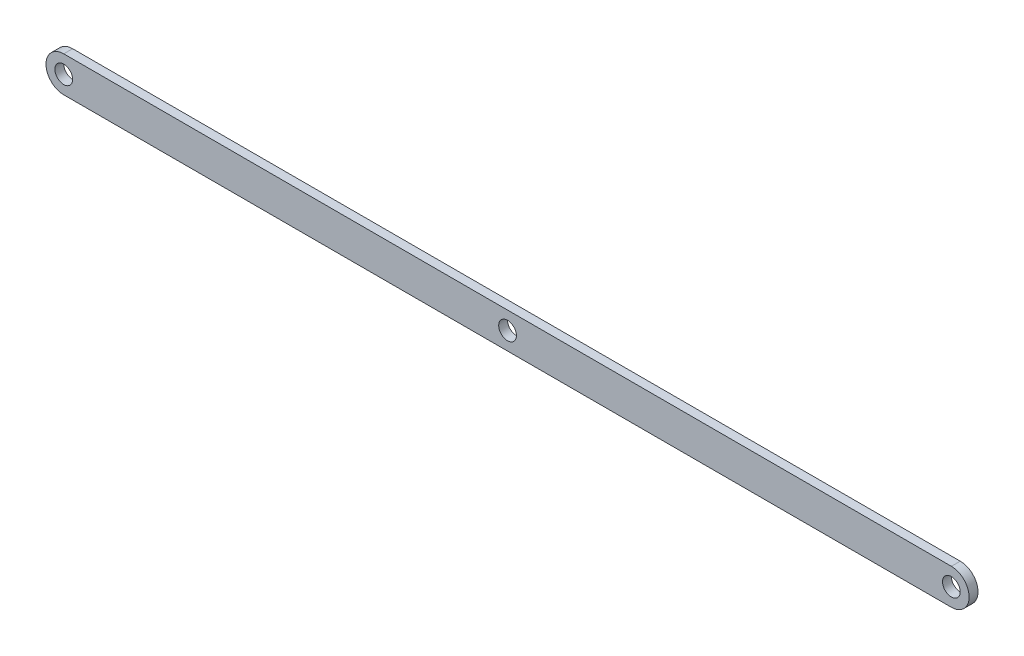
ISO-10303-21;
HEADER;
FILE_DESCRIPTION(('STEP AP214'),'2;1');
FILE_NAME('part.step','',(''),(''),'','','');
FILE_SCHEMA(('AUTOMOTIVE_DESIGN { 1 0 10303 214 1 1 1 1 }'));
ENDSEC;
DATA;
#1=APPLICATION_CONTEXT('core data for automotive mechanical design processes');
#2=APPLICATION_PROTOCOL_DEFINITION('international standard','automotive_design',2000,#1);
#3=PRODUCT_CONTEXT('',#1,'mechanical');
#4=PRODUCT('Part','Part','',(#3));
#5=PRODUCT_RELATED_PRODUCT_CATEGORY('part','',(#4));
#6=PRODUCT_DEFINITION_FORMATION('','',#4);
#7=PRODUCT_DEFINITION_CONTEXT('part definition',#1,'design');
#8=PRODUCT_DEFINITION('design','',#6,#7);
#9=PRODUCT_DEFINITION_SHAPE('','',#8);
#10=(LENGTH_UNIT() NAMED_UNIT(*) SI_UNIT(.MILLI.,.METRE.));
#11=(NAMED_UNIT(*) PLANE_ANGLE_UNIT() SI_UNIT($,.RADIAN.));
#12=(NAMED_UNIT(*) SI_UNIT($,.STERADIAN.) SOLID_ANGLE_UNIT());
#13=UNCERTAINTY_MEASURE_WITH_UNIT(LENGTH_MEASURE(1.E-05),#10,'distance_accuracy_value','');
#14=(GEOMETRIC_REPRESENTATION_CONTEXT(3) GLOBAL_UNCERTAINTY_ASSIGNED_CONTEXT((#13)) GLOBAL_UNIT_ASSIGNED_CONTEXT((#10,
#11,#12)) REPRESENTATION_CONTEXT('',''));
#15=CARTESIAN_POINT('',(0.,0.,0.));
#16=DIRECTION('',(0.,0.,1.));
#17=DIRECTION('',(1.,0.,0.));
#18=AXIS2_PLACEMENT_3D('',#15,#16,#17);
#19=CARTESIAN_POINT('',(-250.,0.,5.));
#20=DIRECTION('',(0.,0.,1.));
#21=DIRECTION('',(1.,0.,0.));
#22=AXIS2_PLACEMENT_3D('',#19,#20,#21);
#23=PLANE('',#22);
#24=CARTESIAN_POINT('',(0.,0.,5.));
#25=DIRECTION('',(0.,0.,1.));
#26=DIRECTION('',(1.,0.,0.));
#27=AXIS2_PLACEMENT_3D('',#24,#25,#26);
#28=CIRCLE('',#27,4.99999999999999);
#29=CARTESIAN_POINT('',(4.99999999999999,0.,5.));
#30=VERTEX_POINT('',#29);
#31=EDGE_CURVE('E117',#30,#30,#28,.T.);
#32=ORIENTED_EDGE('',*,*,#31,.F.);
#33=EDGE_LOOP('',(#32));
#34=FACE_BOUND('',#33,.T.);
#35=CARTESIAN_POINT('',(-250.,0.,5.));
#36=DIRECTION('',(0.,0.,1.));
#37=DIRECTION('',(1.,0.,0.));
#38=AXIS2_PLACEMENT_3D('',#35,#36,#37);
#39=CIRCLE('',#38,10.);
#40=CARTESIAN_POINT('',(-250.,10.,5.));
#41=VERTEX_POINT('',#40);
#42=CARTESIAN_POINT('',(-250.,-10.,5.));
#43=VERTEX_POINT('',#42);
#44=EDGE_CURVE('E87',#41,#43,#39,.T.);
#45=ORIENTED_EDGE('',*,*,#44,.T.);
#46=DIRECTION('',(1.,0.,0.));
#47=VECTOR('',#46,1.);
#48=CARTESIAN_POINT('',(-250.,-10.,5.));
#49=LINE('',#48,#47);
#50=CARTESIAN_POINT('',(250.,-10.,5.));
#51=VERTEX_POINT('',#50);
#52=EDGE_CURVE('E82',#43,#51,#49,.T.);
#53=ORIENTED_EDGE('',*,*,#52,.T.);
#54=CARTESIAN_POINT('',(250.,0.,5.));
#55=DIRECTION('',(0.,0.,1.));
#56=DIRECTION('',(1.,0.,0.));
#57=AXIS2_PLACEMENT_3D('',#54,#55,#56);
#58=CIRCLE('',#57,10.);
#59=CARTESIAN_POINT('',(250.,10.0000000000001,5.));
#60=VERTEX_POINT('',#59);
#61=EDGE_CURVE('E85',#51,#60,#58,.T.);
#62=ORIENTED_EDGE('',*,*,#61,.T.);
#63=DIRECTION('',(-1.,0.,0.));
#64=VECTOR('',#63,1.);
#65=CARTESIAN_POINT('',(-250.,10.,5.));
#66=LINE('',#65,#64);
#67=EDGE_CURVE('E52',#60,#41,#66,.T.);
#68=ORIENTED_EDGE('',*,*,#67,.T.);
#69=EDGE_LOOP('',(#45,#53,#62,#68));
#70=FACE_BOUND('',#69,.T.);
#71=CARTESIAN_POINT('',(-250.,0.,5.));
#72=DIRECTION('',(0.,0.,1.));
#73=DIRECTION('',(1.,0.,0.));
#74=AXIS2_PLACEMENT_3D('',#71,#72,#73);
#75=CIRCLE('',#74,4.99999999999999);
#76=CARTESIAN_POINT('',(-245.,0.,5.));
#77=VERTEX_POINT('',#76);
#78=EDGE_CURVE('E102',#77,#77,#75,.T.);
#79=ORIENTED_EDGE('',*,*,#78,.F.);
#80=EDGE_LOOP('',(#79));
#81=FACE_BOUND('',#80,.T.);
#82=CARTESIAN_POINT('',(250.,0.,5.));
#83=DIRECTION('',(0.,0.,1.));
#84=DIRECTION('',(1.,0.,0.));
#85=AXIS2_PLACEMENT_3D('',#82,#83,#84);
#86=CIRCLE('',#85,4.99999999999999);
#87=CARTESIAN_POINT('',(255.,0.,5.));
#88=VERTEX_POINT('',#87);
#89=EDGE_CURVE('E123',#88,#88,#86,.T.);
#90=ORIENTED_EDGE('',*,*,#89,.F.);
#91=EDGE_LOOP('',(#90));
#92=FACE_BOUND('',#91,.T.);
#93=ADVANCED_FACE('F35',(#34,#70,#81,#92),#23,.T.);
#94=CARTESIAN_POINT('',(-250.,0.,0.));
#95=DIRECTION('',(0.,0.,1.));
#96=DIRECTION('',(1.,0.,0.));
#97=AXIS2_PLACEMENT_3D('',#94,#95,#96);
#98=PLANE('',#97);
#99=CARTESIAN_POINT('',(-250.,0.,0.));
#100=DIRECTION('',(0.,0.,1.));
#101=DIRECTION('',(1.,0.,0.));
#102=AXIS2_PLACEMENT_3D('',#99,#100,#101);
#103=CIRCLE('',#102,10.);
#104=CARTESIAN_POINT('',(-250.,10.,0.));
#105=VERTEX_POINT('',#104);
#106=CARTESIAN_POINT('',(-250.,-10.,0.));
#107=VERTEX_POINT('',#106);
#108=EDGE_CURVE('E99',#105,#107,#103,.T.);
#109=ORIENTED_EDGE('',*,*,#108,.F.);
#110=DIRECTION('',(-1.,0.,0.));
#111=VECTOR('',#110,1.);
#112=CARTESIAN_POINT('',(-250.,10.,0.));
#113=LINE('',#112,#111);
#114=CARTESIAN_POINT('',(250.,10.0000000000001,0.));
#115=VERTEX_POINT('',#114);
#116=EDGE_CURVE('E75',#115,#105,#113,.T.);
#117=ORIENTED_EDGE('',*,*,#116,.F.);
#118=CARTESIAN_POINT('',(250.,0.,0.));
#119=DIRECTION('',(0.,0.,1.));
#120=DIRECTION('',(1.,0.,0.));
#121=AXIS2_PLACEMENT_3D('',#118,#119,#120);
#122=CIRCLE('',#121,10.);
#123=CARTESIAN_POINT('',(250.,-10.,0.));
#124=VERTEX_POINT('',#123);
#125=EDGE_CURVE('E69',#124,#115,#122,.T.);
#126=ORIENTED_EDGE('',*,*,#125,.F.);
#127=DIRECTION('',(1.,0.,0.));
#128=VECTOR('',#127,1.);
#129=CARTESIAN_POINT('',(-250.,-10.,0.));
#130=LINE('',#129,#128);
#131=EDGE_CURVE('E91',#107,#124,#130,.T.);
#132=ORIENTED_EDGE('',*,*,#131,.F.);
#133=EDGE_LOOP('',(#109,#117,#126,#132));
#134=FACE_BOUND('',#133,.T.);
#135=CARTESIAN_POINT('',(-250.,0.,0.));
#136=DIRECTION('',(0.,0.,1.));
#137=DIRECTION('',(1.,0.,0.));
#138=AXIS2_PLACEMENT_3D('',#135,#136,#137);
#139=CIRCLE('',#138,4.99999999999999);
#140=CARTESIAN_POINT('',(-245.,0.,0.));
#141=VERTEX_POINT('',#140);
#142=EDGE_CURVE('E114',#141,#141,#139,.T.);
#143=ORIENTED_EDGE('',*,*,#142,.T.);
#144=EDGE_LOOP('',(#143));
#145=FACE_BOUND('',#144,.T.);
#146=CARTESIAN_POINT('',(0.,0.,0.));
#147=DIRECTION('',(0.,0.,1.));
#148=DIRECTION('',(1.,0.,0.));
#149=AXIS2_PLACEMENT_3D('',#146,#147,#148);
#150=CIRCLE('',#149,4.99999999999999);
#151=CARTESIAN_POINT('',(4.99999999999999,0.,0.));
#152=VERTEX_POINT('',#151);
#153=EDGE_CURVE('E120',#152,#152,#150,.T.);
#154=ORIENTED_EDGE('',*,*,#153,.T.);
#155=EDGE_LOOP('',(#154));
#156=FACE_BOUND('',#155,.T.);
#157=CARTESIAN_POINT('',(250.,0.,0.));
#158=DIRECTION('',(0.,0.,1.));
#159=DIRECTION('',(1.,0.,0.));
#160=AXIS2_PLACEMENT_3D('',#157,#158,#159);
#161=CIRCLE('',#160,4.99999999999999);
#162=CARTESIAN_POINT('',(255.,0.,0.));
#163=VERTEX_POINT('',#162);
#164=EDGE_CURVE('E126',#163,#163,#161,.T.);
#165=ORIENTED_EDGE('',*,*,#164,.T.);
#166=EDGE_LOOP('',(#165));
#167=FACE_BOUND('',#166,.T.);
#168=ADVANCED_FACE('F110',(#134,#145,#156,#167),#98,.F.);
#169=CARTESIAN_POINT('',(-250.,0.,5.));
#170=DIRECTION('',(0.,0.,-1.));
#171=DIRECTION('',(-1.,0.,0.));
#172=AXIS2_PLACEMENT_3D('',#169,#170,#171);
#173=CYLINDRICAL_SURFACE('',#172,10.);
#174=ORIENTED_EDGE('',*,*,#108,.T.);
#175=DIRECTION('',(0.,0.,-1.));
#176=VECTOR('',#175,1.);
#177=CARTESIAN_POINT('',(-250.,-10.,5.));
#178=LINE('',#177,#176);
#179=EDGE_CURVE('E11',#43,#107,#178,.T.);
#180=ORIENTED_EDGE('',*,*,#179,.F.);
#181=ORIENTED_EDGE('',*,*,#44,.F.);
#182=DIRECTION('',(0.,0.,-1.));
#183=VECTOR('',#182,1.);
#184=CARTESIAN_POINT('',(-250.,10.,5.));
#185=LINE('',#184,#183);
#186=EDGE_CURVE('E95',#41,#105,#185,.T.);
#187=ORIENTED_EDGE('',*,*,#186,.T.);
#188=EDGE_LOOP('',(#174,#180,#181,#187));
#189=FACE_BOUND('',#188,.T.);
#190=ADVANCED_FACE('F37',(#189),#173,.T.);
#191=CARTESIAN_POINT('',(-250.,-10.,5.));
#192=DIRECTION('',(0.,1.,0.));
#193=DIRECTION('',(-1.,0.,0.));
#194=AXIS2_PLACEMENT_3D('',#191,#192,#193);
#195=PLANE('',#194);
#196=ORIENTED_EDGE('',*,*,#131,.T.);
#197=DIRECTION('',(0.,0.,-1.));
#198=VECTOR('',#197,1.);
#199=CARTESIAN_POINT('',(250.,-10.,5.));
#200=LINE('',#199,#198);
#201=EDGE_CURVE('E44',#51,#124,#200,.T.);
#202=ORIENTED_EDGE('',*,*,#201,.F.);
#203=ORIENTED_EDGE('',*,*,#52,.F.);
#204=ORIENTED_EDGE('',*,*,#179,.T.);
#205=EDGE_LOOP('',(#196,#202,#203,#204));
#206=FACE_BOUND('',#205,.T.);
#207=ADVANCED_FACE('F90',(#206),#195,.F.);
#208=CARTESIAN_POINT('',(250.,0.,5.));
#209=DIRECTION('',(0.,0.,-1.));
#210=DIRECTION('',(-1.,0.,0.));
#211=AXIS2_PLACEMENT_3D('',#208,#209,#210);
#212=CYLINDRICAL_SURFACE('',#211,10.);
#213=ORIENTED_EDGE('',*,*,#125,.T.);
#214=DIRECTION('',(0.,0.,-1.));
#215=VECTOR('',#214,1.);
#216=CARTESIAN_POINT('',(250.,10.0000000000001,5.));
#217=LINE('',#216,#215);
#218=EDGE_CURVE('E92',#60,#115,#217,.T.);
#219=ORIENTED_EDGE('',*,*,#218,.F.);
#220=ORIENTED_EDGE('',*,*,#61,.F.);
#221=ORIENTED_EDGE('',*,*,#201,.T.);
#222=EDGE_LOOP('',(#213,#219,#220,#221));
#223=FACE_BOUND('',#222,.T.);
#224=ADVANCED_FACE('F93',(#223),#212,.T.);
#225=CARTESIAN_POINT('',(-250.,10.,5.));
#226=DIRECTION('',(0.,-1.,0.));
#227=DIRECTION('',(1.,0.,0.));
#228=AXIS2_PLACEMENT_3D('',#225,#226,#227);
#229=PLANE('',#228);
#230=ORIENTED_EDGE('',*,*,#116,.T.);
#231=ORIENTED_EDGE('',*,*,#186,.F.);
#232=ORIENTED_EDGE('',*,*,#67,.F.);
#233=ORIENTED_EDGE('',*,*,#218,.T.);
#234=EDGE_LOOP('',(#230,#231,#232,#233));
#235=FACE_BOUND('',#234,.T.);
#236=ADVANCED_FACE('F107',(#235),#229,.F.);
#237=CARTESIAN_POINT('',(-250.,0.,5.));
#238=DIRECTION('',(0.,0.,-1.));
#239=DIRECTION('',(-1.,0.,0.));
#240=AXIS2_PLACEMENT_3D('',#237,#238,#239);
#241=CYLINDRICAL_SURFACE('',#240,4.99999999999999);
#242=ORIENTED_EDGE('',*,*,#78,.T.);
#243=EDGE_LOOP('',(#242));
#244=FACE_BOUND('',#243,.T.);
#245=ORIENTED_EDGE('',*,*,#142,.F.);
#246=EDGE_LOOP('',(#245));
#247=FACE_BOUND('',#246,.T.);
#248=ADVANCED_FACE('F144',(#244,#247),#241,.F.);
#249=CARTESIAN_POINT('',(0.,0.,5.));
#250=DIRECTION('',(0.,0.,-1.));
#251=DIRECTION('',(-1.,0.,0.));
#252=AXIS2_PLACEMENT_3D('',#249,#250,#251);
#253=CYLINDRICAL_SURFACE('',#252,4.99999999999999);
#254=ORIENTED_EDGE('',*,*,#31,.T.);
#255=EDGE_LOOP('',(#254));
#256=FACE_BOUND('',#255,.T.);
#257=ORIENTED_EDGE('',*,*,#153,.F.);
#258=EDGE_LOOP('',(#257));
#259=FACE_BOUND('',#258,.T.);
#260=ADVANCED_FACE('F190',(#256,#259),#253,.F.);
#261=CARTESIAN_POINT('',(250.,0.,5.));
#262=DIRECTION('',(0.,0.,-1.));
#263=DIRECTION('',(-1.,0.,0.));
#264=AXIS2_PLACEMENT_3D('',#261,#262,#263);
#265=CYLINDRICAL_SURFACE('',#264,4.99999999999999);
#266=ORIENTED_EDGE('',*,*,#89,.T.);
#267=EDGE_LOOP('',(#266));
#268=FACE_BOUND('',#267,.T.);
#269=ORIENTED_EDGE('',*,*,#164,.F.);
#270=EDGE_LOOP('',(#269));
#271=FACE_BOUND('',#270,.T.);
#272=ADVANCED_FACE('F132',(#268,#271),#265,.F.);
#273=CLOSED_SHELL('',(#93,#168,#190,#207,#224,#236,#248,#260,#272));
#274=MANIFOLD_SOLID_BREP('B2',#273);
#275=ADVANCED_BREP_SHAPE_REPRESENTATION('',(#18,#274),#14);
#276=SHAPE_DEFINITION_REPRESENTATION(#9,#275);
ENDSEC;
END-ISO-10303-21;
